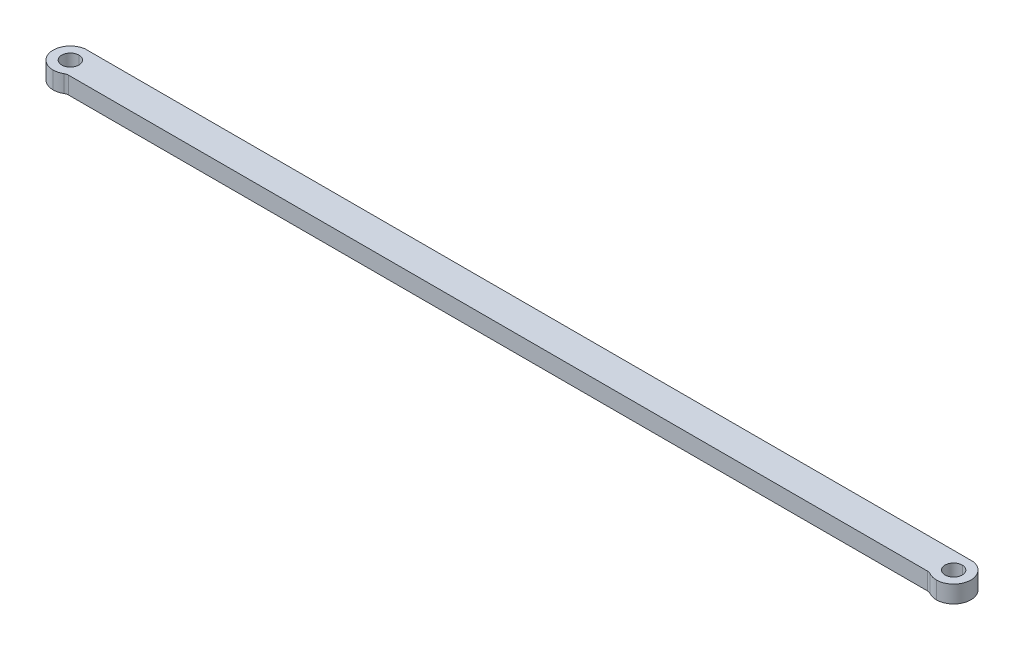
ISO-10303-21;
HEADER;
FILE_DESCRIPTION(('STEP AP214'),'2;1');
FILE_NAME('part.step','',(''),(''),'','','');
FILE_SCHEMA(('AUTOMOTIVE_DESIGN { 1 0 10303 214 1 1 1 1 }'));
ENDSEC;
DATA;
#1=APPLICATION_CONTEXT('core data for automotive mechanical design processes');
#2=APPLICATION_PROTOCOL_DEFINITION('international standard','automotive_design',2000,#1);
#3=PRODUCT_CONTEXT('',#1,'mechanical');
#4=PRODUCT('Part','Part','',(#3));
#5=PRODUCT_RELATED_PRODUCT_CATEGORY('part','',(#4));
#6=PRODUCT_DEFINITION_FORMATION('','',#4);
#7=PRODUCT_DEFINITION_CONTEXT('part definition',#1,'design');
#8=PRODUCT_DEFINITION('design','',#6,#7);
#9=PRODUCT_DEFINITION_SHAPE('','',#8);
#10=(LENGTH_UNIT() NAMED_UNIT(*) SI_UNIT(.MILLI.,.METRE.));
#11=(NAMED_UNIT(*) PLANE_ANGLE_UNIT() SI_UNIT($,.RADIAN.));
#12=(NAMED_UNIT(*) SI_UNIT($,.STERADIAN.) SOLID_ANGLE_UNIT());
#13=UNCERTAINTY_MEASURE_WITH_UNIT(LENGTH_MEASURE(1.E-05),#10,'distance_accuracy_value','');
#14=(GEOMETRIC_REPRESENTATION_CONTEXT(3) GLOBAL_UNCERTAINTY_ASSIGNED_CONTEXT((#13)) GLOBAL_UNIT_ASSIGNED_CONTEXT((#10,
#11,#12)) REPRESENTATION_CONTEXT('',''));
#15=CARTESIAN_POINT('',(0.,0.,0.));
#16=DIRECTION('',(0.,0.,1.));
#17=DIRECTION('',(1.,0.,0.));
#18=AXIS2_PLACEMENT_3D('',#15,#16,#17);
#19=CARTESIAN_POINT('',(-640.530132333997,-94.7859381911068,2.26723199334573));
#20=DIRECTION('',(0.,1.,0.));
#21=DIRECTION('',(0.,0.,1.));
#22=AXIS2_PLACEMENT_3D('',#19,#20,#21);
#23=CYLINDRICAL_SURFACE('',#22,12.5);
#24=CARTESIAN_POINT('',(-640.530132333997,-12.5,2.26723199334573));
#25=DIRECTION('',(0.,1.,0.));
#26=DIRECTION('',(0.,0.,1.));
#27=AXIS2_PLACEMENT_3D('',#24,#25,#26);
#28=CIRCLE('',#27,12.5);
#29=CARTESIAN_POINT('',(-640.530132333997,-12.5,-10.2327680066543));
#30=VERTEX_POINT('',#29);
#31=CARTESIAN_POINT('',(-640.530132333997,-12.5,14.7672319933457));
#32=VERTEX_POINT('',#31);
#33=EDGE_CURVE('E254',#30,#32,#28,.T.);
#34=ORIENTED_EDGE('',*,*,#33,.F.);
#35=DIRECTION('',(0.,1.,0.));
#36=VECTOR('',#35,1.);
#37=CARTESIAN_POINT('',(-640.530132333997,-94.7859381911068,-10.2327680066543));
#38=LINE('',#37,#36);
#39=CARTESIAN_POINT('',(-640.530132333997,12.5,-10.2327680066543));
#40=VERTEX_POINT('',#39);
#41=EDGE_CURVE('E212',#30,#40,#38,.T.);
#42=ORIENTED_EDGE('',*,*,#41,.T.);
#43=CARTESIAN_POINT('',(-640.530132333997,12.5,2.26723199334573));
#44=DIRECTION('',(0.,-1.,0.));
#45=DIRECTION('',(0.,0.,1.));
#46=AXIS2_PLACEMENT_3D('',#43,#44,#45);
#47=CIRCLE('',#46,12.5);
#48=CARTESIAN_POINT('',(-640.530132333997,12.5,14.7672319933457));
#49=VERTEX_POINT('',#48);
#50=EDGE_CURVE('E155',#49,#40,#47,.T.);
#51=ORIENTED_EDGE('',*,*,#50,.F.);
#52=DIRECTION('',(0.,1.,0.));
#53=VECTOR('',#52,1.);
#54=CARTESIAN_POINT('',(-640.530132333997,-94.7859381911068,14.7672319933457));
#55=LINE('',#54,#53);
#56=EDGE_CURVE('E189',#32,#49,#55,.T.);
#57=ORIENTED_EDGE('',*,*,#56,.F.);
#58=EDGE_LOOP('',(#34,#42,#51,#57));
#59=FACE_BOUND('',#58,.T.);
#60=ADVANCED_FACE('F16',(#59),#23,.F.);
#61=CARTESIAN_POINT('',(-640.530132333997,-94.7859381911068,2.26723199334573));
#62=DIRECTION('',(0.,1.,0.));
#63=DIRECTION('',(0.,0.,1.));
#64=AXIS2_PLACEMENT_3D('',#61,#62,#63);
#65=CYLINDRICAL_SURFACE('',#64,25.);
#66=CARTESIAN_POINT('',(-640.530132333997,-12.5,2.26723199334573));
#67=DIRECTION('',(0.,1.,0.));
#68=DIRECTION('',(0.,0.,1.));
#69=AXIS2_PLACEMENT_3D('',#66,#67,#68);
#70=CIRCLE('',#69,25.);
#71=CARTESIAN_POINT('',(-643.933692145105,-12.5,-22.5));
#72=VERTEX_POINT('',#71);
#73=CARTESIAN_POINT('',(-640.530132333997,-12.5,27.2672319933458));
#74=VERTEX_POINT('',#73);
#75=EDGE_CURVE('E207',#72,#74,#70,.T.);
#76=ORIENTED_EDGE('',*,*,#75,.T.);
#77=DIRECTION('',(0.,1.,0.));
#78=VECTOR('',#77,1.);
#79=CARTESIAN_POINT('',(-640.530132333997,-94.7859381911068,27.2672319933458));
#80=LINE('',#79,#78);
#81=CARTESIAN_POINT('',(-640.530132333997,12.5,27.2672319933458));
#82=VERTEX_POINT('',#81);
#83=EDGE_CURVE('E188',#74,#82,#80,.T.);
#84=ORIENTED_EDGE('',*,*,#83,.T.);
#85=CARTESIAN_POINT('',(-640.530132333997,12.5,2.26723199334573));
#86=DIRECTION('',(0.,-1.,0.));
#87=DIRECTION('',(0.,0.,1.));
#88=AXIS2_PLACEMENT_3D('',#85,#86,#87);
#89=CIRCLE('',#88,25.);
#90=CARTESIAN_POINT('',(-643.933692145105,12.5,-22.5));
#91=VERTEX_POINT('',#90);
#92=EDGE_CURVE('E106',#82,#91,#89,.T.);
#93=ORIENTED_EDGE('',*,*,#92,.T.);
#94=DIRECTION('',(0.,1.,0.));
#95=VECTOR('',#94,1.);
#96=CARTESIAN_POINT('',(-643.933692145105,-94.7859381911068,-22.5));
#97=LINE('',#96,#95);
#98=EDGE_CURVE('E11',#72,#91,#97,.T.);
#99=ORIENTED_EDGE('',*,*,#98,.F.);
#100=EDGE_LOOP('',(#76,#84,#93,#99));
#101=FACE_BOUND('',#100,.T.);
#102=ADVANCED_FACE('F319',(#101),#65,.T.);
#103=CARTESIAN_POINT('',(640.530132333997,-94.7859381911068,2.26723199334573));
#104=DIRECTION('',(0.,1.,0.));
#105=DIRECTION('',(0.,0.,1.));
#106=AXIS2_PLACEMENT_3D('',#103,#104,#105);
#107=CYLINDRICAL_SURFACE('',#106,12.5);
#108=CARTESIAN_POINT('',(640.530132333997,-12.5,2.26723199334573));
#109=DIRECTION('',(0.,-1.,0.));
#110=DIRECTION('',(0.,0.,1.));
#111=AXIS2_PLACEMENT_3D('',#108,#109,#110);
#112=CIRCLE('',#111,12.5);
#113=CARTESIAN_POINT('',(640.530132333997,-12.5,14.7672319933457));
#114=VERTEX_POINT('',#113);
#115=CARTESIAN_POINT('',(640.530132333997,-12.5,-10.2327680066543));
#116=VERTEX_POINT('',#115);
#117=EDGE_CURVE('E253',#114,#116,#112,.T.);
#118=ORIENTED_EDGE('',*,*,#117,.T.);
#119=DIRECTION('',(0.,1.,0.));
#120=VECTOR('',#119,1.);
#121=CARTESIAN_POINT('',(640.530132333997,-94.7859381911068,-10.2327680066543));
#122=LINE('',#121,#120);
#123=CARTESIAN_POINT('',(640.530132333997,12.5,-10.2327680066543));
#124=VERTEX_POINT('',#123);
#125=EDGE_CURVE('E217',#116,#124,#122,.T.);
#126=ORIENTED_EDGE('',*,*,#125,.T.);
#127=CARTESIAN_POINT('',(640.530132333997,12.5,2.26723199334573));
#128=DIRECTION('',(0.,1.,0.));
#129=DIRECTION('',(0.,0.,1.));
#130=AXIS2_PLACEMENT_3D('',#127,#128,#129);
#131=CIRCLE('',#130,12.5);
#132=CARTESIAN_POINT('',(640.530132333997,12.5,14.7672319933457));
#133=VERTEX_POINT('',#132);
#134=EDGE_CURVE('E27',#124,#133,#131,.T.);
#135=ORIENTED_EDGE('',*,*,#134,.T.);
#136=DIRECTION('',(0.,1.,0.));
#137=VECTOR('',#136,1.);
#138=CARTESIAN_POINT('',(640.530132333997,-94.7859381911068,14.7672319933457));
#139=LINE('',#138,#137);
#140=EDGE_CURVE('E180',#114,#133,#139,.T.);
#141=ORIENTED_EDGE('',*,*,#140,.F.);
#142=EDGE_LOOP('',(#118,#126,#135,#141));
#143=FACE_BOUND('',#142,.T.);
#144=ADVANCED_FACE('F18',(#143),#107,.F.);
#145=CARTESIAN_POINT('',(640.530132333997,-94.7859381911068,2.26723199334573));
#146=DIRECTION('',(0.,1.,0.));
#147=DIRECTION('',(0.,0.,1.));
#148=AXIS2_PLACEMENT_3D('',#145,#146,#147);
#149=CYLINDRICAL_SURFACE('',#148,25.);
#150=CARTESIAN_POINT('',(640.530132333997,-12.5,2.26723199334573));
#151=DIRECTION('',(0.,-1.,0.));
#152=DIRECTION('',(0.,0.,1.));
#153=AXIS2_PLACEMENT_3D('',#150,#151,#152);
#154=CIRCLE('',#153,25.);
#155=CARTESIAN_POINT('',(640.530132333997,-12.5,27.2672319933458));
#156=VERTEX_POINT('',#155);
#157=CARTESIAN_POINT('',(627.933976890083,-12.5,23.8620662838131));
#158=VERTEX_POINT('',#157);
#159=EDGE_CURVE('E168',#156,#158,#154,.T.);
#160=ORIENTED_EDGE('',*,*,#159,.F.);
#161=DIRECTION('',(0.,1.,0.));
#162=VECTOR('',#161,1.);
#163=CARTESIAN_POINT('',(640.530132333997,-94.7859381911068,27.2672319933458));
#164=LINE('',#163,#162);
#165=CARTESIAN_POINT('',(640.530132333997,12.5,27.2672319933458));
#166=VERTEX_POINT('',#165);
#167=EDGE_CURVE('E161',#156,#166,#164,.T.);
#168=ORIENTED_EDGE('',*,*,#167,.T.);
#169=CARTESIAN_POINT('',(640.530132333997,12.5,2.26723199334573));
#170=DIRECTION('',(0.,1.,0.));
#171=DIRECTION('',(0.,0.,1.));
#172=AXIS2_PLACEMENT_3D('',#169,#170,#171);
#173=CIRCLE('',#172,25.);
#174=CARTESIAN_POINT('',(627.933976890083,12.5,23.8620662838131));
#175=VERTEX_POINT('',#174);
#176=EDGE_CURVE('E143',#175,#166,#173,.T.);
#177=ORIENTED_EDGE('',*,*,#176,.F.);
#178=DIRECTION('',(0.,1.,0.));
#179=VECTOR('',#178,1.);
#180=CARTESIAN_POINT('',(627.933976890083,-94.7859381911068,23.8620662838131));
#181=LINE('',#180,#179);
#182=EDGE_CURVE('E194',#158,#175,#181,.T.);
#183=ORIENTED_EDGE('',*,*,#182,.F.);
#184=EDGE_LOOP('',(#160,#168,#177,#183));
#185=FACE_BOUND('',#184,.T.);
#186=ADVANCED_FACE('F167',(#185),#149,.T.);
#187=CARTESIAN_POINT('',(600.,-12.5,-22.5));
#188=DIRECTION('',(0.,0.,1.));
#189=DIRECTION('',(1.,0.,0.));
#190=AXIS2_PLACEMENT_3D('',#187,#188,#189);
#191=PLANE('',#190);
#192=DIRECTION('',(-1.,0.,0.));
#193=VECTOR('',#192,1.);
#194=CARTESIAN_POINT('',(600.,-12.5,-22.5));
#195=LINE('',#194,#193);
#196=CARTESIAN_POINT('',(643.933692145105,-12.5,-22.5));
#197=VERTEX_POINT('',#196);
#198=EDGE_CURVE('E204',#197,#72,#195,.T.);
#199=ORIENTED_EDGE('',*,*,#198,.T.);
#200=ORIENTED_EDGE('',*,*,#98,.T.);
#201=DIRECTION('',(-1.,0.,0.));
#202=VECTOR('',#201,1.);
#203=CARTESIAN_POINT('',(600.,12.5,-22.5));
#204=LINE('',#203,#202);
#205=CARTESIAN_POINT('',(643.933692145105,12.5,-22.5));
#206=VERTEX_POINT('',#205);
#207=EDGE_CURVE('E190',#206,#91,#204,.T.);
#208=ORIENTED_EDGE('',*,*,#207,.F.);
#209=DIRECTION('',(0.,1.,0.));
#210=VECTOR('',#209,1.);
#211=CARTESIAN_POINT('',(643.933692145105,-94.7859381911068,-22.5));
#212=LINE('',#211,#210);
#213=EDGE_CURVE('E163',#197,#206,#212,.T.);
#214=ORIENTED_EDGE('',*,*,#213,.F.);
#215=EDGE_LOOP('',(#199,#200,#208,#214));
#216=FACE_BOUND('',#215,.T.);
#217=ADVANCED_FACE('F328',(#216),#191,.F.);
#218=CARTESIAN_POINT('',(600.,12.5,22.5));
#219=DIRECTION('',(0.,-1.,0.));
#220=DIRECTION('',(0.,0.,-1.));
#221=AXIS2_PLACEMENT_3D('',#218,#219,#220);
#222=PLANE('',#221);
#223=CARTESIAN_POINT('',(640.530132333997,12.5,2.26723199334573));
#224=DIRECTION('',(0.,1.,0.));
#225=DIRECTION('',(0.,0.,1.));
#226=AXIS2_PLACEMENT_3D('',#223,#224,#225);
#227=CIRCLE('',#226,12.5);
#228=EDGE_CURVE('E171',#133,#124,#227,.T.);
#229=ORIENTED_EDGE('',*,*,#228,.F.);
#230=ORIENTED_EDGE('',*,*,#134,.F.);
#231=EDGE_LOOP('',(#229,#230));
#232=FACE_BOUND('',#231,.T.);
#233=ORIENTED_EDGE('',*,*,#50,.T.);
#234=CARTESIAN_POINT('',(-640.530132333997,12.5,2.26723199334573));
#235=DIRECTION('',(0.,-1.,0.));
#236=DIRECTION('',(0.,0.,1.));
#237=AXIS2_PLACEMENT_3D('',#234,#235,#236);
#238=CIRCLE('',#237,12.5);
#239=EDGE_CURVE('E185',#40,#49,#238,.T.);
#240=ORIENTED_EDGE('',*,*,#239,.T.);
#241=EDGE_LOOP('',(#233,#240));
#242=FACE_BOUND('',#241,.T.);
#243=ORIENTED_EDGE('',*,*,#207,.T.);
#244=ORIENTED_EDGE('',*,*,#92,.F.);
#245=CARTESIAN_POINT('',(-640.530132333997,12.5,2.26723199334573));
#246=DIRECTION('',(0.,-1.,0.));
#247=DIRECTION('',(0.,0.,1.));
#248=AXIS2_PLACEMENT_3D('',#245,#246,#247);
#249=CIRCLE('',#248,25.);
#250=CARTESIAN_POINT('',(-627.933976890083,12.5,23.8620662838131));
#251=VERTEX_POINT('',#250);
#252=EDGE_CURVE('E230',#251,#82,#249,.T.);
#253=ORIENTED_EDGE('',*,*,#252,.F.);
#254=CARTESIAN_POINT('',(-622.895514712517,12.5,32.5));
#255=DIRECTION('',(0.,1.,0.));
#256=DIRECTION('',(0.,0.,1.));
#257=AXIS2_PLACEMENT_3D('',#254,#255,#256);
#258=CIRCLE('',#257,10.);
#259=CARTESIAN_POINT('',(-622.895514712517,12.5,22.5));
#260=VERTEX_POINT('',#259);
#261=EDGE_CURVE('E200',#260,#251,#258,.T.);
#262=ORIENTED_EDGE('',*,*,#261,.F.);
#263=DIRECTION('',(-1.,0.,0.));
#264=VECTOR('',#263,1.);
#265=CARTESIAN_POINT('',(600.,12.5,22.5));
#266=LINE('',#265,#264);
#267=CARTESIAN_POINT('',(622.895514712517,12.5,22.5));
#268=VERTEX_POINT('',#267);
#269=EDGE_CURVE('E193',#268,#260,#266,.T.);
#270=ORIENTED_EDGE('',*,*,#269,.F.);
#271=CARTESIAN_POINT('',(622.895514712517,12.5,32.5));
#272=DIRECTION('',(0.,-1.,0.));
#273=DIRECTION('',(0.,0.,1.));
#274=AXIS2_PLACEMENT_3D('',#271,#272,#273);
#275=CIRCLE('',#274,10.);
#276=EDGE_CURVE('E149',#268,#175,#275,.T.);
#277=ORIENTED_EDGE('',*,*,#276,.T.);
#278=ORIENTED_EDGE('',*,*,#176,.T.);
#279=CARTESIAN_POINT('',(640.530132333997,12.5,2.26723199334573));
#280=DIRECTION('',(0.,1.,0.));
#281=DIRECTION('',(0.,0.,1.));
#282=AXIS2_PLACEMENT_3D('',#279,#280,#281);
#283=CIRCLE('',#282,25.);
#284=EDGE_CURVE('E146',#166,#206,#283,.T.);
#285=ORIENTED_EDGE('',*,*,#284,.T.);
#286=EDGE_LOOP('',(#243,#244,#253,#262,#270,#277,#278,#285));
#287=FACE_BOUND('',#286,.T.);
#288=ADVANCED_FACE('F145',(#232,#242,#287),#222,.F.);
#289=CARTESIAN_POINT('',(600.,-12.5,22.5));
#290=DIRECTION('',(0.,0.,-1.));
#291=DIRECTION('',(0.,-1.,0.));
#292=AXIS2_PLACEMENT_3D('',#289,#290,#291);
#293=PLANE('',#292);
#294=ORIENTED_EDGE('',*,*,#269,.T.);
#295=DIRECTION('',(0.,1.,0.));
#296=VECTOR('',#295,1.);
#297=CARTESIAN_POINT('',(-622.895514712517,-94.7859381911068,22.5));
#298=LINE('',#297,#296);
#299=CARTESIAN_POINT('',(-622.895514712517,-12.5,22.5));
#300=VERTEX_POINT('',#299);
#301=EDGE_CURVE('E203',#300,#260,#298,.T.);
#302=ORIENTED_EDGE('',*,*,#301,.F.);
#303=DIRECTION('',(-1.,0.,0.));
#304=VECTOR('',#303,1.);
#305=CARTESIAN_POINT('',(600.,-12.5,22.5));
#306=LINE('',#305,#304);
#307=CARTESIAN_POINT('',(622.895514712517,-12.5,22.5));
#308=VERTEX_POINT('',#307);
#309=EDGE_CURVE('E165',#308,#300,#306,.T.);
#310=ORIENTED_EDGE('',*,*,#309,.F.);
#311=DIRECTION('',(0.,1.,0.));
#312=VECTOR('',#311,1.);
#313=CARTESIAN_POINT('',(622.895514712517,-94.7859381911068,22.5));
#314=LINE('',#313,#312);
#315=EDGE_CURVE('E213',#308,#268,#314,.T.);
#316=ORIENTED_EDGE('',*,*,#315,.T.);
#317=EDGE_LOOP('',(#294,#302,#310,#316));
#318=FACE_BOUND('',#317,.T.);
#319=ADVANCED_FACE('F305',(#318),#293,.F.);
#320=CARTESIAN_POINT('',(600.,-12.5,22.5));
#321=DIRECTION('',(0.,1.,0.));
#322=DIRECTION('',(1.,0.,0.));
#323=AXIS2_PLACEMENT_3D('',#320,#321,#322);
#324=PLANE('',#323);
#325=ORIENTED_EDGE('',*,*,#117,.F.);
#326=CARTESIAN_POINT('',(640.530132333997,-12.5,2.26723199334573));
#327=DIRECTION('',(0.,-1.,0.));
#328=DIRECTION('',(0.,0.,1.));
#329=AXIS2_PLACEMENT_3D('',#326,#327,#328);
#330=CIRCLE('',#329,12.5);
#331=EDGE_CURVE('E225',#116,#114,#330,.T.);
#332=ORIENTED_EDGE('',*,*,#331,.F.);
#333=EDGE_LOOP('',(#325,#332));
#334=FACE_BOUND('',#333,.T.);
#335=CARTESIAN_POINT('',(-640.530132333997,-12.5,2.26723199334573));
#336=DIRECTION('',(0.,1.,0.));
#337=DIRECTION('',(0.,0.,1.));
#338=AXIS2_PLACEMENT_3D('',#335,#336,#337);
#339=CIRCLE('',#338,12.5);
#340=EDGE_CURVE('E208',#32,#30,#339,.T.);
#341=ORIENTED_EDGE('',*,*,#340,.T.);
#342=ORIENTED_EDGE('',*,*,#33,.T.);
#343=EDGE_LOOP('',(#341,#342));
#344=FACE_BOUND('',#343,.T.);
#345=ORIENTED_EDGE('',*,*,#309,.T.);
#346=CARTESIAN_POINT('',(-622.895514712517,-12.5,32.5));
#347=DIRECTION('',(0.,-1.,0.));
#348=DIRECTION('',(0.,0.,1.));
#349=AXIS2_PLACEMENT_3D('',#346,#347,#348);
#350=CIRCLE('',#349,10.);
#351=CARTESIAN_POINT('',(-627.933976890083,-12.5,23.8620662838131));
#352=VERTEX_POINT('',#351);
#353=EDGE_CURVE('E92',#352,#300,#350,.T.);
#354=ORIENTED_EDGE('',*,*,#353,.F.);
#355=CARTESIAN_POINT('',(-640.530132333997,-12.5,2.26723199334573));
#356=DIRECTION('',(0.,1.,0.));
#357=DIRECTION('',(0.,0.,1.));
#358=AXIS2_PLACEMENT_3D('',#355,#356,#357);
#359=CIRCLE('',#358,25.);
#360=EDGE_CURVE('E221',#74,#352,#359,.T.);
#361=ORIENTED_EDGE('',*,*,#360,.F.);
#362=ORIENTED_EDGE('',*,*,#75,.F.);
#363=ORIENTED_EDGE('',*,*,#198,.F.);
#364=CARTESIAN_POINT('',(640.530132333997,-12.5,2.26723199334573));
#365=DIRECTION('',(0.,-1.,0.));
#366=DIRECTION('',(0.,0.,1.));
#367=AXIS2_PLACEMENT_3D('',#364,#365,#366);
#368=CIRCLE('',#367,25.);
#369=EDGE_CURVE('E20',#197,#156,#368,.T.);
#370=ORIENTED_EDGE('',*,*,#369,.T.);
#371=ORIENTED_EDGE('',*,*,#159,.T.);
#372=CARTESIAN_POINT('',(622.895514712517,-12.5,32.5));
#373=DIRECTION('',(0.,1.,0.));
#374=DIRECTION('',(0.,0.,1.));
#375=AXIS2_PLACEMENT_3D('',#372,#373,#374);
#376=CIRCLE('',#375,10.);
#377=EDGE_CURVE('E197',#158,#308,#376,.T.);
#378=ORIENTED_EDGE('',*,*,#377,.T.);
#379=EDGE_LOOP('',(#345,#354,#361,#362,#363,#370,#371,#378));
#380=FACE_BOUND('',#379,.T.);
#381=ADVANCED_FACE('F303',(#334,#344,#380),#324,.F.);
#382=CARTESIAN_POINT('',(640.530132333997,-94.7859381911068,2.26723199334573));
#383=DIRECTION('',(0.,1.,0.));
#384=DIRECTION('',(0.,0.,1.));
#385=AXIS2_PLACEMENT_3D('',#382,#383,#384);
#386=CYLINDRICAL_SURFACE('',#385,25.);
#387=ORIENTED_EDGE('',*,*,#167,.F.);
#388=ORIENTED_EDGE('',*,*,#369,.F.);
#389=ORIENTED_EDGE('',*,*,#213,.T.);
#390=ORIENTED_EDGE('',*,*,#284,.F.);
#391=EDGE_LOOP('',(#387,#388,#389,#390));
#392=FACE_BOUND('',#391,.T.);
#393=ADVANCED_FACE('F159',(#392),#386,.T.);
#394=CARTESIAN_POINT('',(640.530132333997,-94.7859381911068,2.26723199334573));
#395=DIRECTION('',(0.,1.,0.));
#396=DIRECTION('',(0.,0.,1.));
#397=AXIS2_PLACEMENT_3D('',#394,#395,#396);
#398=CYLINDRICAL_SURFACE('',#397,12.5);
#399=ORIENTED_EDGE('',*,*,#125,.F.);
#400=ORIENTED_EDGE('',*,*,#331,.T.);
#401=ORIENTED_EDGE('',*,*,#140,.T.);
#402=ORIENTED_EDGE('',*,*,#228,.T.);
#403=EDGE_LOOP('',(#399,#400,#401,#402));
#404=FACE_BOUND('',#403,.T.);
#405=ADVANCED_FACE('F313',(#404),#398,.F.);
#406=CARTESIAN_POINT('',(622.895514712517,-94.7859381911068,32.5));
#407=DIRECTION('',(0.,1.,0.));
#408=DIRECTION('',(0.,0.,1.));
#409=AXIS2_PLACEMENT_3D('',#406,#407,#408);
#410=CYLINDRICAL_SURFACE('',#409,10.);
#411=ORIENTED_EDGE('',*,*,#377,.F.);
#412=ORIENTED_EDGE('',*,*,#182,.T.);
#413=ORIENTED_EDGE('',*,*,#276,.F.);
#414=ORIENTED_EDGE('',*,*,#315,.F.);
#415=EDGE_LOOP('',(#411,#412,#413,#414));
#416=FACE_BOUND('',#415,.T.);
#417=ADVANCED_FACE('F481',(#416),#410,.F.);
#418=CARTESIAN_POINT('',(-622.895514712517,-94.7859381911068,32.5));
#419=DIRECTION('',(0.,1.,0.));
#420=DIRECTION('',(0.,0.,1.));
#421=AXIS2_PLACEMENT_3D('',#418,#419,#420);
#422=CYLINDRICAL_SURFACE('',#421,10.);
#423=DIRECTION('',(0.,1.,0.));
#424=VECTOR('',#423,1.);
#425=CARTESIAN_POINT('',(-627.933976890083,-94.7859381911068,23.8620662838131));
#426=LINE('',#425,#424);
#427=EDGE_CURVE('E270',#352,#251,#426,.T.);
#428=ORIENTED_EDGE('',*,*,#427,.F.);
#429=ORIENTED_EDGE('',*,*,#353,.T.);
#430=ORIENTED_EDGE('',*,*,#301,.T.);
#431=ORIENTED_EDGE('',*,*,#261,.T.);
#432=EDGE_LOOP('',(#428,#429,#430,#431));
#433=FACE_BOUND('',#432,.T.);
#434=ADVANCED_FACE('F470',(#433),#422,.F.);
#435=CARTESIAN_POINT('',(-640.530132333997,-94.7859381911068,2.26723199334573));
#436=DIRECTION('',(0.,1.,0.));
#437=DIRECTION('',(0.,0.,1.));
#438=AXIS2_PLACEMENT_3D('',#435,#436,#437);
#439=CYLINDRICAL_SURFACE('',#438,25.);
#440=ORIENTED_EDGE('',*,*,#83,.F.);
#441=ORIENTED_EDGE('',*,*,#360,.T.);
#442=ORIENTED_EDGE('',*,*,#427,.T.);
#443=ORIENTED_EDGE('',*,*,#252,.T.);
#444=EDGE_LOOP('',(#440,#441,#442,#443));
#445=FACE_BOUND('',#444,.T.);
#446=ADVANCED_FACE('F338',(#445),#439,.T.);
#447=CARTESIAN_POINT('',(-640.530132333997,-94.7859381911068,2.26723199334573));
#448=DIRECTION('',(0.,1.,0.));
#449=DIRECTION('',(0.,0.,1.));
#450=AXIS2_PLACEMENT_3D('',#447,#448,#449);
#451=CYLINDRICAL_SURFACE('',#450,12.5);
#452=ORIENTED_EDGE('',*,*,#41,.F.);
#453=ORIENTED_EDGE('',*,*,#340,.F.);
#454=ORIENTED_EDGE('',*,*,#56,.T.);
#455=ORIENTED_EDGE('',*,*,#239,.F.);
#456=EDGE_LOOP('',(#452,#453,#454,#455));
#457=FACE_BOUND('',#456,.T.);
#458=ADVANCED_FACE('F300',(#457),#451,.F.);
#459=CLOSED_SHELL('',(#60,#102,#144,#186,#217,#288,#319,#381,#393,#405,#417,#434,#446,#458));
#460=MANIFOLD_SOLID_BREP('B1',#459);
#461=ADVANCED_BREP_SHAPE_REPRESENTATION('',(#18,#460),#14);
#462=SHAPE_DEFINITION_REPRESENTATION(#9,#461);
ENDSEC;
END-ISO-10303-21;
